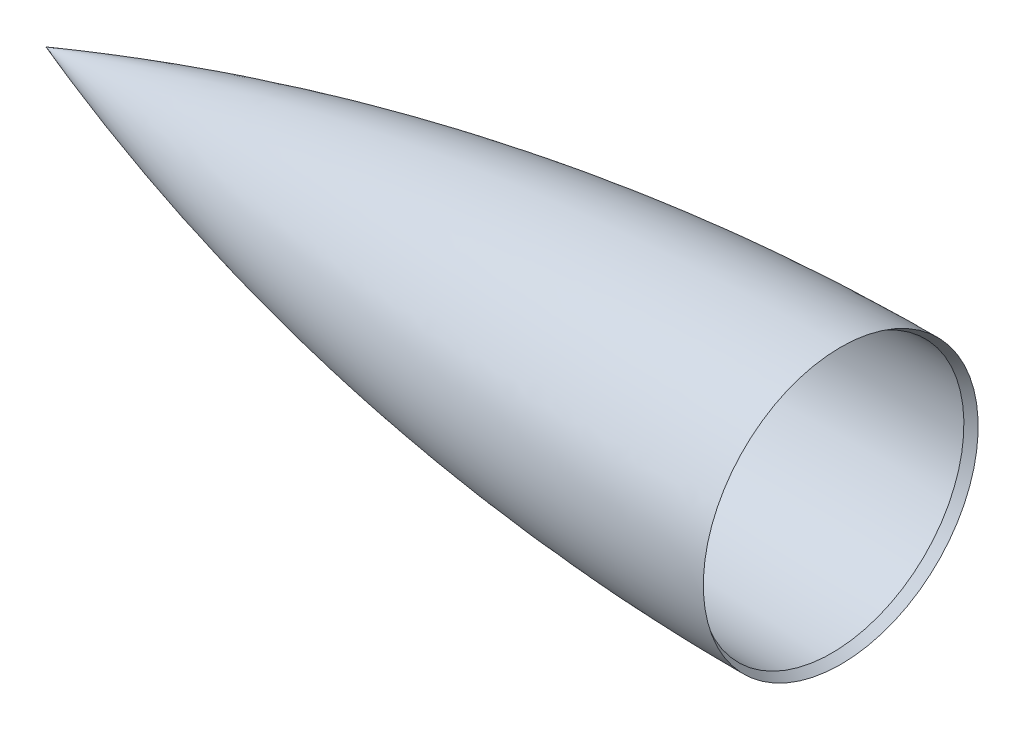
ISO-10303-21;
HEADER;
FILE_DESCRIPTION(('STEP AP214'),'2;1');
FILE_NAME('part.step','',(''),(''),'','','');
FILE_SCHEMA(('AUTOMOTIVE_DESIGN { 1 0 10303 214 1 1 1 1 }'));
ENDSEC;
DATA;
#1=APPLICATION_CONTEXT('core data for automotive mechanical design processes');
#2=APPLICATION_PROTOCOL_DEFINITION('international standard','automotive_design',2000,#1);
#3=PRODUCT_CONTEXT('',#1,'mechanical');
#4=PRODUCT('Part','Part','',(#3));
#5=PRODUCT_RELATED_PRODUCT_CATEGORY('part','',(#4));
#6=PRODUCT_DEFINITION_FORMATION('','',#4);
#7=PRODUCT_DEFINITION_CONTEXT('part definition',#1,'design');
#8=PRODUCT_DEFINITION('design','',#6,#7);
#9=PRODUCT_DEFINITION_SHAPE('','',#8);
#10=(LENGTH_UNIT() NAMED_UNIT(*) SI_UNIT(.MILLI.,.METRE.));
#11=(NAMED_UNIT(*) PLANE_ANGLE_UNIT() SI_UNIT($,.RADIAN.));
#12=(NAMED_UNIT(*) SI_UNIT($,.STERADIAN.) SOLID_ANGLE_UNIT());
#13=UNCERTAINTY_MEASURE_WITH_UNIT(LENGTH_MEASURE(1.E-05),#10,'distance_accuracy_value','');
#14=(GEOMETRIC_REPRESENTATION_CONTEXT(3) GLOBAL_UNCERTAINTY_ASSIGNED_CONTEXT((#13)) GLOBAL_UNIT_ASSIGNED_CONTEXT((#10,
#11,#12)) REPRESENTATION_CONTEXT('',''));
#15=CARTESIAN_POINT('',(0.,0.,0.));
#16=DIRECTION('',(0.,0.,1.));
#17=DIRECTION('',(1.,0.,0.));
#18=AXIS2_PLACEMENT_3D('',#15,#16,#17);
#19=CARTESIAN_POINT('',(-79.2,0.,0.));
#20=DIRECTION('',(1.,0.,0.));
#21=DIRECTION('',(0.,1.,0.));
#22=AXIS2_PLACEMENT_3D('',#19,#20,#21);
#23=CONICAL_SURFACE('',#22,33.4749869638065,0.523598775598271);
#24=CARTESIAN_POINT('',(-82.5018168790993,0.,0.));
#25=DIRECTION('',(1.,0.,0.));
#26=DIRECTION('',(0.,1.,0.));
#27=AXIS2_PLACEMENT_3D('',#24,#25,#26);
#28=CIRCLE('',#27,31.5686820998438);
#29=CARTESIAN_POINT('',(-82.5018168790993,31.5686820998437,0.));
#30=VERTEX_POINT('',#29);
#31=EDGE_CURVE('E78',#30,#30,#28,.T.);
#32=ORIENTED_EDGE('',*,*,#31,.F.);
#33=EDGE_LOOP('',(#32));
#34=FACE_BOUND('',#33,.T.);
#35=CARTESIAN_POINT('',(-79.2,0.,0.));
#36=DIRECTION('',(1.,0.,0.));
#37=DIRECTION('',(0.,1.,0.));
#38=AXIS2_PLACEMENT_3D('',#35,#36,#37);
#39=CIRCLE('',#38,33.4749869638065);
#40=CARTESIAN_POINT('',(-79.2,33.4749869638065,0.));
#41=VERTEX_POINT('',#40);
#42=EDGE_CURVE('E11',#41,#41,#39,.T.);
#43=ORIENTED_EDGE('',*,*,#42,.T.);
#44=EDGE_LOOP('',(#43));
#45=FACE_BOUND('',#44,.T.);
#46=ADVANCED_FACE('F39',(#34,#45),#23,.F.);
#47=CARTESIAN_POINT('',(0.,0.,0.));
#48=DIRECTION('',(1.,0.,0.));
#49=DIRECTION('',(0.,1.,0.));
#50=AXIS2_PLACEMENT_3D('',#47,#48,#49);
#51=DEGENERATE_TOROIDAL_SURFACE('',#50,642.33383838384,680.43383838384,.F.);
#52=CARTESIAN_POINT('',(-2.60672462856481,0.,0.));
#53=DIRECTION('',(1.,0.,0.));
#54=DIRECTION('',(0.,1.,0.));
#55=AXIS2_PLACEMENT_3D('',#52,#53,#54);
#56=CIRCLE('',#55,38.0950068339949);
#57=CARTESIAN_POINT('',(-2.60672462856482,38.0950068339949,0.));
#58=VERTEX_POINT('',#57);
#59=EDGE_CURVE('E47',#58,#58,#56,.T.);
#60=ORIENTED_EDGE('',*,*,#59,.T.);
#61=EDGE_LOOP('',(#60));
#62=FACE_BOUND('',#61,.T.);
#63=ORIENTED_EDGE('',*,*,#42,.F.);
#64=EDGE_LOOP('',(#63));
#65=FACE_BOUND('',#64,.T.);
#66=ADVANCED_FACE('F65',(#62,#65),#51,.T.);
#67=CARTESIAN_POINT('',(0.,0.,0.));
#68=DIRECTION('',(1.,0.,0.));
#69=DIRECTION('',(0.,1.,0.));
#70=AXIS2_PLACEMENT_3D('',#67,#68,#69);
#71=CONICAL_SURFACE('',#70,39.6,0.523598775598294);
#72=ORIENTED_EDGE('',*,*,#59,.F.);
#73=EDGE_LOOP('',(#72));
#74=FACE_BOUND('',#73,.T.);
#75=CARTESIAN_POINT('',(0.,0.,0.));
#76=DIRECTION('',(1.,0.,0.));
#77=DIRECTION('',(0.,1.,0.));
#78=AXIS2_PLACEMENT_3D('',#75,#76,#77);
#79=CIRCLE('',#78,39.6);
#80=CARTESIAN_POINT('',(0.,39.6,0.));
#81=VERTEX_POINT('',#80);
#82=EDGE_CURVE('E82',#81,#81,#79,.T.);
#83=ORIENTED_EDGE('',*,*,#82,.T.);
#84=EDGE_LOOP('',(#83));
#85=FACE_BOUND('',#84,.T.);
#86=ADVANCED_FACE('F56',(#74,#85),#71,.F.);
#87=CARTESIAN_POINT('',(0.,-642.33383838384,0.));
#88=DIRECTION('',(0.,0.,-1.));
#89=DIRECTION('',(0.,1.,0.));
#90=AXIS2_PLACEMENT_3D('',#87,#88,#89);
#91=CIRCLE('',#90,681.93383838384);
#92=TRIMMED_CURVE('',#91,(PARAMETER_VALUE(-0.342464720280552)),
(PARAMETER_VALUE(0.342464720280552)),.T.,.PARAMETER.);
#93=CARTESIAN_POINT('',(0.,0.,0.));
#94=DIRECTION('',(1.,0.,0.));
#95=AXIS1_PLACEMENT('',#93,#94);
#96=SURFACE_OF_REVOLUTION('',#92,#95);
#97=ORIENTED_EDGE('',*,*,#82,.F.);
#98=EDGE_LOOP('',(#97));
#99=FACE_BOUND('',#98,.T.);
#100=CARTESIAN_POINT('',(-229.,-7.9350408246198E-13,0.));
#101=VERTEX_POINT('',#100);
#102=VERTEX_LOOP('',#101);
#103=FACE_BOUND('',#102,.T.);
#104=ADVANCED_FACE('F53',(#99,#103),#96,.T.);
#105=CARTESIAN_POINT('',(0.,-642.33383838384,0.));
#106=DIRECTION('',(0.,0.,-1.));
#107=DIRECTION('',(0.,1.,0.));
#108=AXIS2_PLACEMENT_3D('',#105,#106,#107);
#109=CIRCLE('',#108,678.93383838384);
#110=TRIMMED_CURVE('',#109,(PARAMETER_VALUE(-0.329846882865527)),
(PARAMETER_VALUE(0.329846882865527)),.T.,.PARAMETER.);
#111=CARTESIAN_POINT('',(0.,0.,0.));
#112=DIRECTION('',(1.,0.,0.));
#113=AXIS1_PLACEMENT('',#111,#112);
#114=SURFACE_OF_REVOLUTION('',#110,#113);
#115=ORIENTED_EDGE('',*,*,#31,.T.);
#116=EDGE_LOOP('',(#115));
#117=FACE_BOUND('',#116,.T.);
#118=CARTESIAN_POINT('',(-219.905427331153,-7.61990630317975E-13,0.));
#119=VERTEX_POINT('',#118);
#120=VERTEX_LOOP('',#119);
#121=FACE_BOUND('',#120,.T.);
#122=ADVANCED_FACE('F55',(#117,#121),#114,.F.);
#123=CLOSED_SHELL('',(#46,#66,#86,#104,#122));
#124=MANIFOLD_SOLID_BREP('B2',#123);
#125=ADVANCED_BREP_SHAPE_REPRESENTATION('',(#18,#124),#14);
#126=SHAPE_DEFINITION_REPRESENTATION(#9,#125);
ENDSEC;
END-ISO-10303-21;
